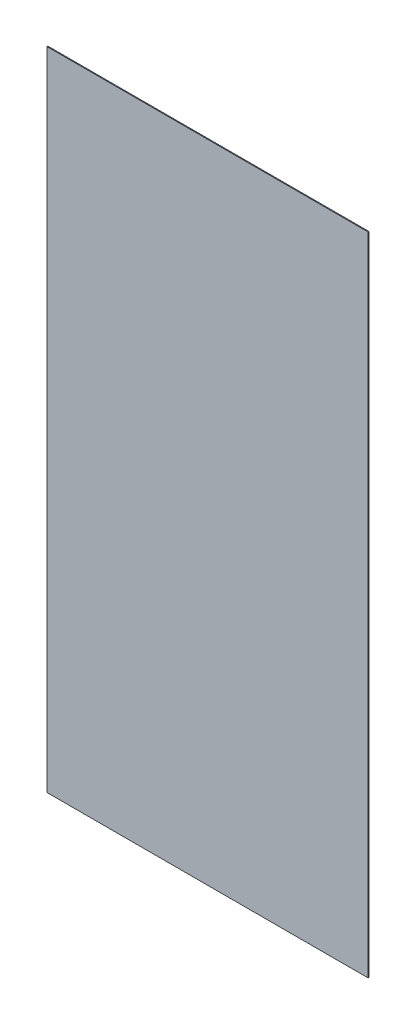
ISO-10303-21;
HEADER;
FILE_DESCRIPTION(('STEP AP214'),'2;1');
FILE_NAME('part.step','',(''),(''),'','','');
FILE_SCHEMA(('AUTOMOTIVE_DESIGN { 1 0 10303 214 1 1 1 1 }'));
ENDSEC;
DATA;
#1=APPLICATION_CONTEXT('core data for automotive mechanical design processes');
#2=APPLICATION_PROTOCOL_DEFINITION('international standard','automotive_design',2000,#1);
#3=PRODUCT_CONTEXT('',#1,'mechanical');
#4=PRODUCT('Part','Part','',(#3));
#5=PRODUCT_RELATED_PRODUCT_CATEGORY('part','',(#4));
#6=PRODUCT_DEFINITION_FORMATION('','',#4);
#7=PRODUCT_DEFINITION_CONTEXT('part definition',#1,'design');
#8=PRODUCT_DEFINITION('design','',#6,#7);
#9=PRODUCT_DEFINITION_SHAPE('','',#8);
#10=(LENGTH_UNIT() NAMED_UNIT(*) SI_UNIT(.MILLI.,.METRE.));
#11=(NAMED_UNIT(*) PLANE_ANGLE_UNIT() SI_UNIT($,.RADIAN.));
#12=(NAMED_UNIT(*) SI_UNIT($,.STERADIAN.) SOLID_ANGLE_UNIT());
#13=UNCERTAINTY_MEASURE_WITH_UNIT(LENGTH_MEASURE(1.E-05),#10,'distance_accuracy_value','');
#14=(GEOMETRIC_REPRESENTATION_CONTEXT(3) GLOBAL_UNCERTAINTY_ASSIGNED_CONTEXT((#13)) GLOBAL_UNIT_ASSIGNED_CONTEXT((#10,
#11,#12)) REPRESENTATION_CONTEXT('',''));
#15=CARTESIAN_POINT('',(0.,0.,0.));
#16=DIRECTION('',(0.,0.,1.));
#17=DIRECTION('',(1.,0.,0.));
#18=AXIS2_PLACEMENT_3D('',#15,#16,#17);
#19=CARTESIAN_POINT('',(0.,0.,1.651));
#20=DIRECTION('',(1.,0.,0.));
#21=DIRECTION('',(0.,0.,-1.));
#22=AXIS2_PLACEMENT_3D('',#19,#20,#21);
#23=PLANE('',#22);
#24=DIRECTION('',(0.,-1.,0.));
#25=VECTOR('',#24,1.);
#26=CARTESIAN_POINT('',(0.,0.,0.));
#27=LINE('',#26,#25);
#28=CARTESIAN_POINT('',(0.,1212.85,0.));
#29=VERTEX_POINT('',#28);
#30=CARTESIAN_POINT('',(0.,0.,0.));
#31=VERTEX_POINT('',#30);
#32=EDGE_CURVE('E95',#29,#31,#27,.T.);
#33=ORIENTED_EDGE('',*,*,#32,.T.);
#34=DIRECTION('',(0.,0.,-1.));
#35=VECTOR('',#34,1.);
#36=CARTESIAN_POINT('',(0.,0.,1.651));
#37=LINE('',#36,#35);
#38=CARTESIAN_POINT('',(0.,0.,1.651));
#39=VERTEX_POINT('',#38);
#40=EDGE_CURVE('E11',#39,#31,#37,.T.);
#41=ORIENTED_EDGE('',*,*,#40,.F.);
#42=DIRECTION('',(0.,-1.,0.));
#43=VECTOR('',#42,1.);
#44=CARTESIAN_POINT('',(0.,0.,1.651));
#45=LINE('',#44,#43);
#46=CARTESIAN_POINT('',(0.,1212.85,1.651));
#47=VERTEX_POINT('',#46);
#48=EDGE_CURVE('E83',#47,#39,#45,.T.);
#49=ORIENTED_EDGE('',*,*,#48,.F.);
#50=DIRECTION('',(0.,0.,-1.));
#51=VECTOR('',#50,1.);
#52=CARTESIAN_POINT('',(0.,1212.85,1.651));
#53=LINE('',#52,#51);
#54=EDGE_CURVE('E91',#47,#29,#53,.T.);
#55=ORIENTED_EDGE('',*,*,#54,.T.);
#56=EDGE_LOOP('',(#33,#41,#49,#55));
#57=FACE_BOUND('',#56,.T.);
#58=ADVANCED_FACE('F32',(#57),#23,.F.);
#59=CARTESIAN_POINT('',(0.,0.,1.651));
#60=DIRECTION('',(0.,1.,0.));
#61=DIRECTION('',(0.,0.,1.));
#62=AXIS2_PLACEMENT_3D('',#59,#60,#61);
#63=PLANE('',#62);
#64=DIRECTION('',(1.,0.,0.));
#65=VECTOR('',#64,1.);
#66=CARTESIAN_POINT('',(0.,0.,0.));
#67=LINE('',#66,#65);
#68=CARTESIAN_POINT('',(603.25,0.,0.));
#69=VERTEX_POINT('',#68);
#70=EDGE_CURVE('E87',#31,#69,#67,.T.);
#71=ORIENTED_EDGE('',*,*,#70,.T.);
#72=DIRECTION('',(0.,0.,-1.));
#73=VECTOR('',#72,1.);
#74=CARTESIAN_POINT('',(603.25,0.,1.651));
#75=LINE('',#74,#73);
#76=CARTESIAN_POINT('',(603.25,0.,1.651));
#77=VERTEX_POINT('',#76);
#78=EDGE_CURVE('E40',#77,#69,#75,.T.);
#79=ORIENTED_EDGE('',*,*,#78,.F.);
#80=DIRECTION('',(1.,0.,0.));
#81=VECTOR('',#80,1.);
#82=CARTESIAN_POINT('',(0.,0.,1.651));
#83=LINE('',#82,#81);
#84=EDGE_CURVE('E78',#39,#77,#83,.T.);
#85=ORIENTED_EDGE('',*,*,#84,.F.);
#86=ORIENTED_EDGE('',*,*,#40,.T.);
#87=EDGE_LOOP('',(#71,#79,#85,#86));
#88=FACE_BOUND('',#87,.T.);
#89=ADVANCED_FACE('F86',(#88),#63,.F.);
#90=CARTESIAN_POINT('',(603.25,0.,1.651));
#91=DIRECTION('',(-1.,0.,0.));
#92=DIRECTION('',(0.,0.,1.));
#93=AXIS2_PLACEMENT_3D('',#90,#91,#92);
#94=PLANE('',#93);
#95=DIRECTION('',(0.,1.,0.));
#96=VECTOR('',#95,1.);
#97=CARTESIAN_POINT('',(603.25,0.,0.));
#98=LINE('',#97,#96);
#99=CARTESIAN_POINT('',(603.25,1212.85,0.));
#100=VERTEX_POINT('',#99);
#101=EDGE_CURVE('E65',#69,#100,#98,.T.);
#102=ORIENTED_EDGE('',*,*,#101,.T.);
#103=DIRECTION('',(0.,0.,-1.));
#104=VECTOR('',#103,1.);
#105=CARTESIAN_POINT('',(603.25,1212.85,1.651));
#106=LINE('',#105,#104);
#107=CARTESIAN_POINT('',(603.25,1212.85,1.651));
#108=VERTEX_POINT('',#107);
#109=EDGE_CURVE('E88',#108,#100,#106,.T.);
#110=ORIENTED_EDGE('',*,*,#109,.F.);
#111=DIRECTION('',(0.,1.,0.));
#112=VECTOR('',#111,1.);
#113=CARTESIAN_POINT('',(603.25,0.,1.651));
#114=LINE('',#113,#112);
#115=EDGE_CURVE('E81',#77,#108,#114,.T.);
#116=ORIENTED_EDGE('',*,*,#115,.F.);
#117=ORIENTED_EDGE('',*,*,#78,.T.);
#118=EDGE_LOOP('',(#102,#110,#116,#117));
#119=FACE_BOUND('',#118,.T.);
#120=ADVANCED_FACE('F89',(#119),#94,.F.);
#121=CARTESIAN_POINT('',(0.,1212.85,1.651));
#122=DIRECTION('',(0.,-1.,0.));
#123=DIRECTION('',(0.,0.,-1.));
#124=AXIS2_PLACEMENT_3D('',#121,#122,#123);
#125=PLANE('',#124);
#126=DIRECTION('',(-1.,0.,0.));
#127=VECTOR('',#126,1.);
#128=CARTESIAN_POINT('',(0.,1212.85,0.));
#129=LINE('',#128,#127);
#130=EDGE_CURVE('E71',#100,#29,#129,.T.);
#131=ORIENTED_EDGE('',*,*,#130,.T.);
#132=ORIENTED_EDGE('',*,*,#54,.F.);
#133=DIRECTION('',(-1.,0.,0.));
#134=VECTOR('',#133,1.);
#135=CARTESIAN_POINT('',(0.,1212.85,1.651));
#136=LINE('',#135,#134);
#137=EDGE_CURVE('E48',#108,#47,#136,.T.);
#138=ORIENTED_EDGE('',*,*,#137,.F.);
#139=ORIENTED_EDGE('',*,*,#109,.T.);
#140=EDGE_LOOP('',(#131,#132,#138,#139));
#141=FACE_BOUND('',#140,.T.);
#142=ADVANCED_FACE('F102',(#141),#125,.F.);
#143=CARTESIAN_POINT('',(0.,0.,1.651));
#144=DIRECTION('',(0.,0.,-1.));
#145=DIRECTION('',(-1.,0.,0.));
#146=AXIS2_PLACEMENT_3D('',#143,#144,#145);
#147=PLANE('',#146);
#148=ORIENTED_EDGE('',*,*,#48,.T.);
#149=ORIENTED_EDGE('',*,*,#84,.T.);
#150=ORIENTED_EDGE('',*,*,#115,.T.);
#151=ORIENTED_EDGE('',*,*,#137,.T.);
#152=EDGE_LOOP('',(#148,#149,#150,#151));
#153=FACE_BOUND('',#152,.T.);
#154=ADVANCED_FACE('F79',(#153),#147,.F.);
#155=CARTESIAN_POINT('',(0.,0.,0.));
#156=DIRECTION('',(0.,0.,-1.));
#157=DIRECTION('',(-1.,0.,0.));
#158=AXIS2_PLACEMENT_3D('',#155,#156,#157);
#159=PLANE('',#158);
#160=ORIENTED_EDGE('',*,*,#32,.F.);
#161=ORIENTED_EDGE('',*,*,#130,.F.);
#162=ORIENTED_EDGE('',*,*,#101,.F.);
#163=ORIENTED_EDGE('',*,*,#70,.F.);
#164=EDGE_LOOP('',(#160,#161,#162,#163));
#165=FACE_BOUND('',#164,.T.);
#166=ADVANCED_FACE('F105',(#165),#159,.T.);
#167=CLOSED_SHELL('',(#58,#89,#120,#142,#154,#166));
#168=MANIFOLD_SOLID_BREP('B2',#167);
#169=ADVANCED_BREP_SHAPE_REPRESENTATION('',(#18,#168),#14);
#170=SHAPE_DEFINITION_REPRESENTATION(#9,#169);
ENDSEC;
END-ISO-10303-21;
